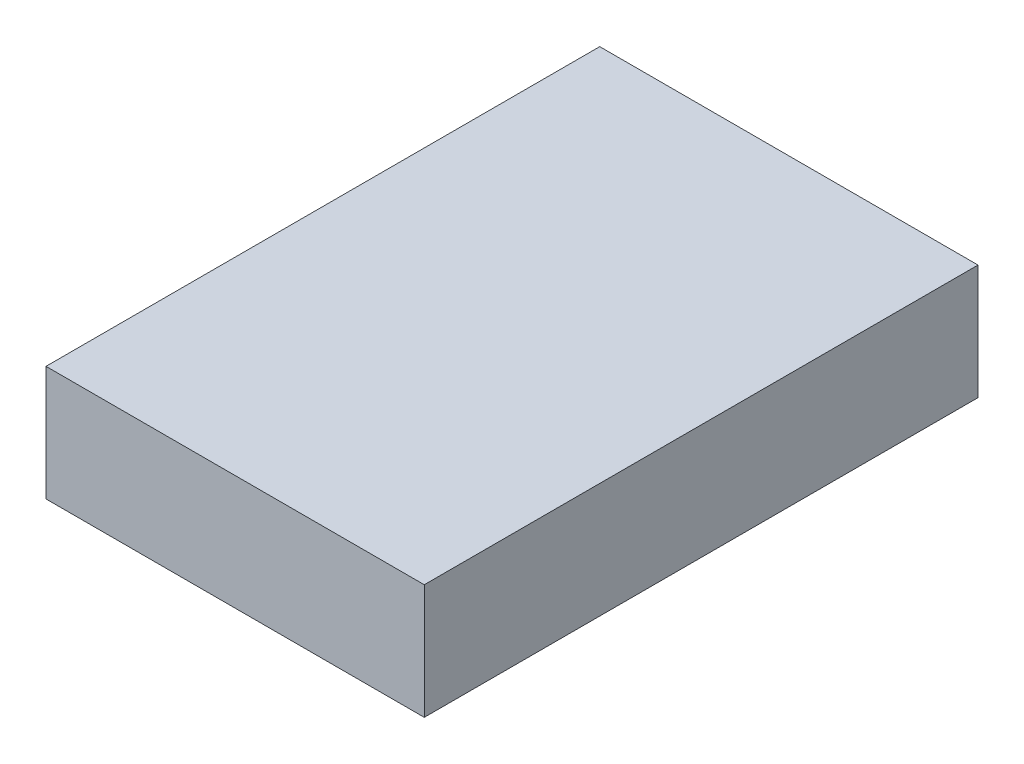
ISO-10303-21;
HEADER;
FILE_DESCRIPTION(('STEP AP214'),'2;1');
FILE_NAME('part.step','',(''),(''),'','','');
FILE_SCHEMA(('AUTOMOTIVE_DESIGN { 1 0 10303 214 1 1 1 1 }'));
ENDSEC;
DATA;
#1=APPLICATION_CONTEXT('core data for automotive mechanical design processes');
#2=APPLICATION_PROTOCOL_DEFINITION('international standard','automotive_design',2000,#1);
#3=PRODUCT_CONTEXT('',#1,'mechanical');
#4=PRODUCT('Part','Part','',(#3));
#5=PRODUCT_RELATED_PRODUCT_CATEGORY('part','',(#4));
#6=PRODUCT_DEFINITION_FORMATION('','',#4);
#7=PRODUCT_DEFINITION_CONTEXT('part definition',#1,'design');
#8=PRODUCT_DEFINITION('design','',#6,#7);
#9=PRODUCT_DEFINITION_SHAPE('','',#8);
#10=(LENGTH_UNIT() NAMED_UNIT(*) SI_UNIT(.MILLI.,.METRE.));
#11=(NAMED_UNIT(*) PLANE_ANGLE_UNIT() SI_UNIT($,.RADIAN.));
#12=(NAMED_UNIT(*) SI_UNIT($,.STERADIAN.) SOLID_ANGLE_UNIT());
#13=UNCERTAINTY_MEASURE_WITH_UNIT(LENGTH_MEASURE(1.E-05),#10,'distance_accuracy_value','');
#14=(GEOMETRIC_REPRESENTATION_CONTEXT(3) GLOBAL_UNCERTAINTY_ASSIGNED_CONTEXT((#13)) GLOBAL_UNIT_ASSIGNED_CONTEXT((#10,
#11,#12)) REPRESENTATION_CONTEXT('',''));
#15=CARTESIAN_POINT('',(0.,0.,0.));
#16=DIRECTION('',(0.,0.,1.));
#17=DIRECTION('',(1.,0.,0.));
#18=AXIS2_PLACEMENT_3D('',#15,#16,#17);
#19=CARTESIAN_POINT('',(0.,6.5024,-31.3436));
#20=DIRECTION('',(1.,0.,0.));
#21=DIRECTION('',(0.,0.,-1.));
#22=AXIS2_PLACEMENT_3D('',#19,#20,#21);
#23=PLANE('',#22);
#24=DIRECTION('',(0.,0.,1.));
#25=VECTOR('',#24,1.);
#26=CARTESIAN_POINT('',(0.,0.,-31.3436));
#27=LINE('',#26,#25);
#28=CARTESIAN_POINT('',(0.,0.,-31.3436));
#29=VERTEX_POINT('',#28);
#30=CARTESIAN_POINT('',(0.,0.,0.));
#31=VERTEX_POINT('',#30);
#32=EDGE_CURVE('E100',#29,#31,#27,.T.);
#33=ORIENTED_EDGE('',*,*,#32,.T.);
#34=DIRECTION('',(0.,-1.,0.));
#35=VECTOR('',#34,1.);
#36=CARTESIAN_POINT('',(0.,6.5024,0.));
#37=LINE('',#36,#35);
#38=CARTESIAN_POINT('',(0.,6.5024,0.));
#39=VERTEX_POINT('',#38);
#40=EDGE_CURVE('E11',#39,#31,#37,.T.);
#41=ORIENTED_EDGE('',*,*,#40,.F.);
#42=DIRECTION('',(0.,0.,1.));
#43=VECTOR('',#42,1.);
#44=CARTESIAN_POINT('',(0.,6.5024,-31.3436));
#45=LINE('',#44,#43);
#46=CARTESIAN_POINT('',(0.,6.5024,-31.3436));
#47=VERTEX_POINT('',#46);
#48=EDGE_CURVE('E88',#47,#39,#45,.T.);
#49=ORIENTED_EDGE('',*,*,#48,.F.);
#50=DIRECTION('',(0.,-1.,0.));
#51=VECTOR('',#50,1.);
#52=CARTESIAN_POINT('',(0.,6.5024,-31.3436));
#53=LINE('',#52,#51);
#54=EDGE_CURVE('E96',#47,#29,#53,.T.);
#55=ORIENTED_EDGE('',*,*,#54,.T.);
#56=EDGE_LOOP('',(#33,#41,#49,#55));
#57=FACE_BOUND('',#56,.T.);
#58=ADVANCED_FACE('F37',(#57),#23,.F.);
#59=CARTESIAN_POINT('',(0.,6.5024,0.));
#60=DIRECTION('',(0.,0.,-1.));
#61=DIRECTION('',(-1.,0.,0.));
#62=AXIS2_PLACEMENT_3D('',#59,#60,#61);
#63=PLANE('',#62);
#64=DIRECTION('',(1.,0.,0.));
#65=VECTOR('',#64,1.);
#66=CARTESIAN_POINT('',(0.,0.,0.));
#67=LINE('',#66,#65);
#68=CARTESIAN_POINT('',(21.4122,0.,0.));
#69=VERTEX_POINT('',#68);
#70=EDGE_CURVE('E92',#31,#69,#67,.T.);
#71=ORIENTED_EDGE('',*,*,#70,.T.);
#72=DIRECTION('',(0.,-1.,0.));
#73=VECTOR('',#72,1.);
#74=CARTESIAN_POINT('',(21.4122,6.5024,0.));
#75=LINE('',#74,#73);
#76=CARTESIAN_POINT('',(21.4122,6.5024,0.));
#77=VERTEX_POINT('',#76);
#78=EDGE_CURVE('E45',#77,#69,#75,.T.);
#79=ORIENTED_EDGE('',*,*,#78,.F.);
#80=DIRECTION('',(1.,0.,0.));
#81=VECTOR('',#80,1.);
#82=CARTESIAN_POINT('',(0.,6.5024,0.));
#83=LINE('',#82,#81);
#84=EDGE_CURVE('E83',#39,#77,#83,.T.);
#85=ORIENTED_EDGE('',*,*,#84,.F.);
#86=ORIENTED_EDGE('',*,*,#40,.T.);
#87=EDGE_LOOP('',(#71,#79,#85,#86));
#88=FACE_BOUND('',#87,.T.);
#89=ADVANCED_FACE('F91',(#88),#63,.F.);
#90=CARTESIAN_POINT('',(21.4122,6.5024,0.));
#91=DIRECTION('',(-1.,0.,0.));
#92=DIRECTION('',(0.,0.,1.));
#93=AXIS2_PLACEMENT_3D('',#90,#91,#92);
#94=PLANE('',#93);
#95=DIRECTION('',(0.,0.,-1.));
#96=VECTOR('',#95,1.);
#97=CARTESIAN_POINT('',(21.4122,0.,0.));
#98=LINE('',#97,#96);
#99=CARTESIAN_POINT('',(21.4122,0.,-31.3436));
#100=VERTEX_POINT('',#99);
#101=EDGE_CURVE('E70',#69,#100,#98,.T.);
#102=ORIENTED_EDGE('',*,*,#101,.T.);
#103=DIRECTION('',(0.,-1.,0.));
#104=VECTOR('',#103,1.);
#105=CARTESIAN_POINT('',(21.4122,6.5024,-31.3436));
#106=LINE('',#105,#104);
#107=CARTESIAN_POINT('',(21.4122,6.5024,-31.3436));
#108=VERTEX_POINT('',#107);
#109=EDGE_CURVE('E93',#108,#100,#106,.T.);
#110=ORIENTED_EDGE('',*,*,#109,.F.);
#111=DIRECTION('',(0.,0.,-1.));
#112=VECTOR('',#111,1.);
#113=CARTESIAN_POINT('',(21.4122,6.5024,0.));
#114=LINE('',#113,#112);
#115=EDGE_CURVE('E86',#77,#108,#114,.T.);
#116=ORIENTED_EDGE('',*,*,#115,.F.);
#117=ORIENTED_EDGE('',*,*,#78,.T.);
#118=EDGE_LOOP('',(#102,#110,#116,#117));
#119=FACE_BOUND('',#118,.T.);
#120=ADVANCED_FACE('F94',(#119),#94,.F.);
#121=CARTESIAN_POINT('',(21.4122,6.5024,-31.3436));
#122=DIRECTION('',(0.,0.,1.));
#123=DIRECTION('',(1.,0.,0.));
#124=AXIS2_PLACEMENT_3D('',#121,#122,#123);
#125=PLANE('',#124);
#126=DIRECTION('',(-1.,0.,0.));
#127=VECTOR('',#126,1.);
#128=CARTESIAN_POINT('',(21.4122,0.,-31.3436));
#129=LINE('',#128,#127);
#130=EDGE_CURVE('E76',#100,#29,#129,.T.);
#131=ORIENTED_EDGE('',*,*,#130,.T.);
#132=ORIENTED_EDGE('',*,*,#54,.F.);
#133=DIRECTION('',(-1.,0.,0.));
#134=VECTOR('',#133,1.);
#135=CARTESIAN_POINT('',(21.4122,6.5024,-31.3436));
#136=LINE('',#135,#134);
#137=EDGE_CURVE('E53',#108,#47,#136,.T.);
#138=ORIENTED_EDGE('',*,*,#137,.F.);
#139=ORIENTED_EDGE('',*,*,#109,.T.);
#140=EDGE_LOOP('',(#131,#132,#138,#139));
#141=FACE_BOUND('',#140,.T.);
#142=ADVANCED_FACE('F107',(#141),#125,.F.);
#143=CARTESIAN_POINT('',(0.,6.5024,0.));
#144=DIRECTION('',(0.,1.,0.));
#145=DIRECTION('',(0.,0.,1.));
#146=AXIS2_PLACEMENT_3D('',#143,#144,#145);
#147=PLANE('',#146);
#148=ORIENTED_EDGE('',*,*,#48,.T.);
#149=ORIENTED_EDGE('',*,*,#84,.T.);
#150=ORIENTED_EDGE('',*,*,#115,.T.);
#151=ORIENTED_EDGE('',*,*,#137,.T.);
#152=EDGE_LOOP('',(#148,#149,#150,#151));
#153=FACE_BOUND('',#152,.T.);
#154=ADVANCED_FACE('F84',(#153),#147,.T.);
#155=CARTESIAN_POINT('',(0.,0.,0.));
#156=DIRECTION('',(0.,1.,0.));
#157=DIRECTION('',(0.,0.,1.));
#158=AXIS2_PLACEMENT_3D('',#155,#156,#157);
#159=PLANE('',#158);
#160=ORIENTED_EDGE('',*,*,#32,.F.);
#161=ORIENTED_EDGE('',*,*,#130,.F.);
#162=ORIENTED_EDGE('',*,*,#101,.F.);
#163=ORIENTED_EDGE('',*,*,#70,.F.);
#164=EDGE_LOOP('',(#160,#161,#162,#163));
#165=FACE_BOUND('',#164,.T.);
#166=ADVANCED_FACE('F110',(#165),#159,.F.);
#167=CLOSED_SHELL('',(#58,#89,#120,#142,#154,#166));
#168=MANIFOLD_SOLID_BREP('B2',#167);
#169=ADVANCED_BREP_SHAPE_REPRESENTATION('',(#18,#168),#14);
#170=SHAPE_DEFINITION_REPRESENTATION(#9,#169);
ENDSEC;
END-ISO-10303-21;
